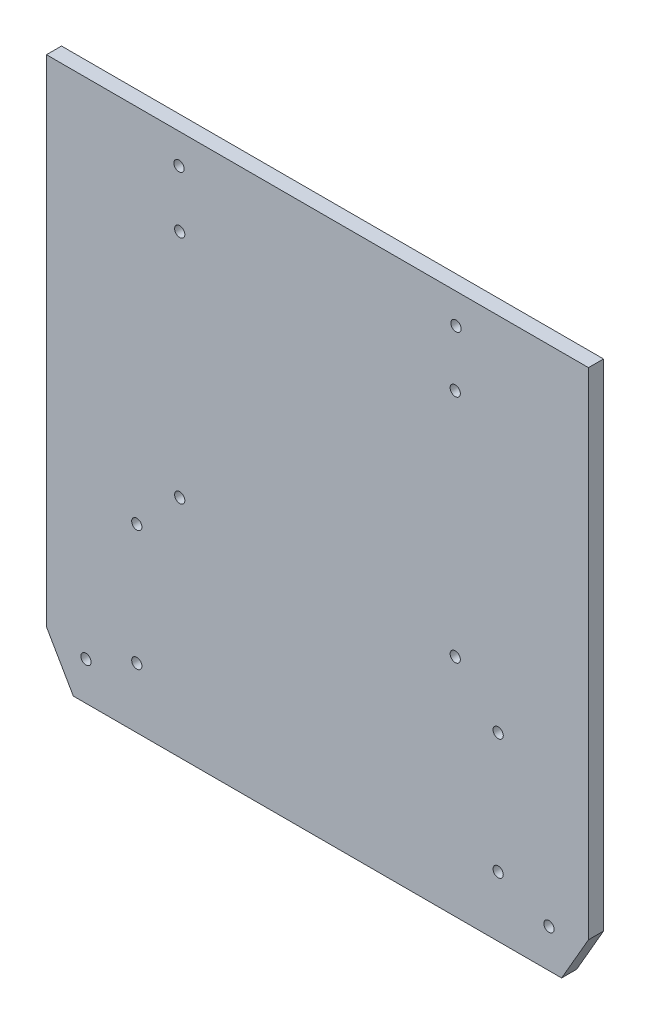
ISO-10303-21;
HEADER;
FILE_DESCRIPTION(('STEP AP214'),'2;1');
FILE_NAME('part.step','',(''),(''),'','','');
FILE_SCHEMA(('AUTOMOTIVE_DESIGN { 1 0 10303 214 1 1 1 1 }'));
ENDSEC;
DATA;
#1=APPLICATION_CONTEXT('core data for automotive mechanical design processes');
#2=APPLICATION_PROTOCOL_DEFINITION('international standard','automotive_design',2000,#1);
#3=PRODUCT_CONTEXT('',#1,'mechanical');
#4=PRODUCT('Part','Part','',(#3));
#5=PRODUCT_RELATED_PRODUCT_CATEGORY('part','',(#4));
#6=PRODUCT_DEFINITION_FORMATION('','',#4);
#7=PRODUCT_DEFINITION_CONTEXT('part definition',#1,'design');
#8=PRODUCT_DEFINITION('design','',#6,#7);
#9=PRODUCT_DEFINITION_SHAPE('','',#8);
#10=(LENGTH_UNIT() NAMED_UNIT(*) SI_UNIT(.MILLI.,.METRE.));
#11=(NAMED_UNIT(*) PLANE_ANGLE_UNIT() SI_UNIT($,.RADIAN.));
#12=(NAMED_UNIT(*) SI_UNIT($,.STERADIAN.) SOLID_ANGLE_UNIT());
#13=UNCERTAINTY_MEASURE_WITH_UNIT(LENGTH_MEASURE(1.E-05),#10,'distance_accuracy_value','');
#14=(GEOMETRIC_REPRESENTATION_CONTEXT(3) GLOBAL_UNCERTAINTY_ASSIGNED_CONTEXT((#13)) GLOBAL_UNIT_ASSIGNED_CONTEXT((#10,
#11,#12)) REPRESENTATION_CONTEXT('',''));
#15=CARTESIAN_POINT('',(0.,0.,0.));
#16=DIRECTION('',(0.,0.,1.));
#17=DIRECTION('',(1.,0.,0.));
#18=AXIS2_PLACEMENT_3D('',#15,#16,#17);
#19=CARTESIAN_POINT('',(-90.,90.,5.));
#20=DIRECTION('',(1.,0.,0.));
#21=DIRECTION('',(0.,1.,0.));
#22=AXIS2_PLACEMENT_3D('',#19,#20,#21);
#23=PLANE('',#22);
#24=DIRECTION('',(0.,-1.,0.));
#25=VECTOR('',#24,1.);
#26=CARTESIAN_POINT('',(-90.,90.,0.));
#27=LINE('',#26,#25);
#28=CARTESIAN_POINT('',(-90.,90.,0.));
#29=VERTEX_POINT('',#28);
#30=CARTESIAN_POINT('',(-90.,-74.5448267190433,0.));
#31=VERTEX_POINT('',#30);
#32=EDGE_CURVE('E108',#29,#31,#27,.T.);
#33=ORIENTED_EDGE('',*,*,#32,.T.);
#34=DIRECTION('',(0.,0.,1.));
#35=VECTOR('',#34,1.);
#36=CARTESIAN_POINT('',(-90.,-74.5448267190434,0.));
#37=LINE('',#36,#35);
#38=CARTESIAN_POINT('',(-90.,-74.5448267190434,5.));
#39=VERTEX_POINT('',#38);
#40=EDGE_CURVE('E55',#31,#39,#37,.T.);
#41=ORIENTED_EDGE('',*,*,#40,.T.);
#42=DIRECTION('',(0.,-1.,0.));
#43=VECTOR('',#42,1.);
#44=CARTESIAN_POINT('',(-90.,90.,5.));
#45=LINE('',#44,#43);
#46=CARTESIAN_POINT('',(-90.,90.,5.));
#47=VERTEX_POINT('',#46);
#48=EDGE_CURVE('E106',#47,#39,#45,.T.);
#49=ORIENTED_EDGE('',*,*,#48,.F.);
#50=DIRECTION('',(0.,0.,-1.));
#51=VECTOR('',#50,1.);
#52=CARTESIAN_POINT('',(-90.,90.,5.));
#53=LINE('',#52,#51);
#54=EDGE_CURVE('E40',#47,#29,#53,.T.);
#55=ORIENTED_EDGE('',*,*,#54,.T.);
#56=EDGE_LOOP('',(#33,#41,#49,#55));
#57=FACE_BOUND('',#56,.T.);
#58=ADVANCED_FACE('F33',(#57),#23,.F.);
#59=CARTESIAN_POINT('',(-90.,-90.,5.));
#60=DIRECTION('',(0.,1.,0.));
#61=DIRECTION('',(0.,0.,1.));
#62=AXIS2_PLACEMENT_3D('',#59,#60,#61);
#63=PLANE('',#62);
#64=DIRECTION('',(1.,0.,0.));
#65=VECTOR('',#64,1.);
#66=CARTESIAN_POINT('',(-90.,-90.,0.));
#67=LINE('',#66,#65);
#68=CARTESIAN_POINT('',(-81.0769515458673,-90.,0.));
#69=VERTEX_POINT('',#68);
#70=CARTESIAN_POINT('',(81.0769515458674,-90.,0.));
#71=VERTEX_POINT('',#70);
#72=EDGE_CURVE('E104',#69,#71,#67,.T.);
#73=ORIENTED_EDGE('',*,*,#72,.T.);
#74=DIRECTION('',(0.,0.,1.));
#75=VECTOR('',#74,1.);
#76=CARTESIAN_POINT('',(81.0769515458674,-90.,0.));
#77=LINE('',#76,#75);
#78=CARTESIAN_POINT('',(81.0769515458674,-90.,5.));
#79=VERTEX_POINT('',#78);
#80=EDGE_CURVE('E47',#71,#79,#77,.T.);
#81=ORIENTED_EDGE('',*,*,#80,.T.);
#82=DIRECTION('',(1.,0.,0.));
#83=VECTOR('',#82,1.);
#84=CARTESIAN_POINT('',(-90.,-90.,5.));
#85=LINE('',#84,#83);
#86=CARTESIAN_POINT('',(-81.0769515458673,-90.,5.));
#87=VERTEX_POINT('',#86);
#88=EDGE_CURVE('E121',#87,#79,#85,.T.);
#89=ORIENTED_EDGE('',*,*,#88,.F.);
#90=DIRECTION('',(0.,0.,1.));
#91=VECTOR('',#90,1.);
#92=CARTESIAN_POINT('',(-81.0769515458673,-90.,0.));
#93=LINE('',#92,#91);
#94=EDGE_CURVE('E146',#69,#87,#93,.T.);
#95=ORIENTED_EDGE('',*,*,#94,.F.);
#96=EDGE_LOOP('',(#73,#81,#89,#95));
#97=FACE_BOUND('',#96,.T.);
#98=ADVANCED_FACE('F145',(#97),#63,.F.);
#99=CARTESIAN_POINT('',(90.,90.,5.));
#100=DIRECTION('',(-1.,0.,0.));
#101=DIRECTION('',(0.,-1.,0.));
#102=AXIS2_PLACEMENT_3D('',#99,#100,#101);
#103=PLANE('',#102);
#104=DIRECTION('',(0.,1.,0.));
#105=VECTOR('',#104,1.);
#106=CARTESIAN_POINT('',(90.,90.,5.));
#107=LINE('',#106,#105);
#108=CARTESIAN_POINT('',(90.,-74.5448267190434,5.));
#109=VERTEX_POINT('',#108);
#110=CARTESIAN_POINT('',(90.,90.,5.));
#111=VERTEX_POINT('',#110);
#112=EDGE_CURVE('E98',#109,#111,#107,.T.);
#113=ORIENTED_EDGE('',*,*,#112,.F.);
#114=DIRECTION('',(0.,0.,1.));
#115=VECTOR('',#114,1.);
#116=CARTESIAN_POINT('',(90.,-74.5448267190434,0.));
#117=LINE('',#116,#115);
#118=CARTESIAN_POINT('',(90.,-74.5448267190434,0.));
#119=VERTEX_POINT('',#118);
#120=EDGE_CURVE('E85',#119,#109,#117,.T.);
#121=ORIENTED_EDGE('',*,*,#120,.F.);
#122=DIRECTION('',(0.,1.,0.));
#123=VECTOR('',#122,1.);
#124=CARTESIAN_POINT('',(90.,90.,0.));
#125=LINE('',#124,#123);
#126=CARTESIAN_POINT('',(90.,90.,0.));
#127=VERTEX_POINT('',#126);
#128=EDGE_CURVE('E97',#119,#127,#125,.T.);
#129=ORIENTED_EDGE('',*,*,#128,.T.);
#130=DIRECTION('',(0.,0.,-1.));
#131=VECTOR('',#130,1.);
#132=CARTESIAN_POINT('',(90.,90.,5.));
#133=LINE('',#132,#131);
#134=EDGE_CURVE('E11',#111,#127,#133,.T.);
#135=ORIENTED_EDGE('',*,*,#134,.F.);
#136=EDGE_LOOP('',(#113,#121,#129,#135));
#137=FACE_BOUND('',#136,.T.);
#138=ADVANCED_FACE('F95',(#137),#103,.F.);
#139=CARTESIAN_POINT('',(-90.,90.,5.));
#140=DIRECTION('',(0.,-1.,0.));
#141=DIRECTION('',(0.,0.,-1.));
#142=AXIS2_PLACEMENT_3D('',#139,#140,#141);
#143=PLANE('',#142);
#144=DIRECTION('',(-1.,0.,0.));
#145=VECTOR('',#144,1.);
#146=CARTESIAN_POINT('',(-90.,90.,0.));
#147=LINE('',#146,#145);
#148=EDGE_CURVE('E103',#127,#29,#147,.T.);
#149=ORIENTED_EDGE('',*,*,#148,.T.);
#150=ORIENTED_EDGE('',*,*,#54,.F.);
#151=DIRECTION('',(-1.,0.,0.));
#152=VECTOR('',#151,1.);
#153=CARTESIAN_POINT('',(-90.,90.,5.));
#154=LINE('',#153,#152);
#155=EDGE_CURVE('E112',#111,#47,#154,.T.);
#156=ORIENTED_EDGE('',*,*,#155,.F.);
#157=ORIENTED_EDGE('',*,*,#134,.T.);
#158=EDGE_LOOP('',(#149,#150,#156,#157));
#159=FACE_BOUND('',#158,.T.);
#160=ADVANCED_FACE('F163',(#159),#143,.F.);
#161=CARTESIAN_POINT('',(0.,0.,5.));
#162=DIRECTION('',(0.,0.,1.));
#163=DIRECTION('',(1.,0.,0.));
#164=AXIS2_PLACEMENT_3D('',#161,#162,#163);
#165=PLANE('',#164);
#166=CARTESIAN_POINT('',(-60.,-70.,5.));
#167=DIRECTION('',(0.,0.,1.));
#168=DIRECTION('',(1.,0.,0.));
#169=AXIS2_PLACEMENT_3D('',#166,#167,#168);
#170=CIRCLE('',#169,1.7);
#171=CARTESIAN_POINT('',(-58.3,-70.,5.));
#172=VERTEX_POINT('',#171);
#173=EDGE_CURVE('E412',#172,#172,#170,.T.);
#174=ORIENTED_EDGE('',*,*,#173,.F.);
#175=EDGE_LOOP('',(#174));
#176=FACE_BOUND('',#175,.T.);
#177=CARTESIAN_POINT('',(60.,-70.,5.));
#178=DIRECTION('',(0.,0.,1.));
#179=DIRECTION('',(-1.,0.,0.));
#180=AXIS2_PLACEMENT_3D('',#177,#178,#179);
#181=CIRCLE('',#180,1.7);
#182=CARTESIAN_POINT('',(58.3,-70.,5.));
#183=VERTEX_POINT('',#182);
#184=EDGE_CURVE('E406',#183,#183,#181,.T.);
#185=ORIENTED_EDGE('',*,*,#184,.F.);
#186=EDGE_LOOP('',(#185));
#187=FACE_BOUND('',#186,.T.);
#188=CARTESIAN_POINT('',(60.,-30.,5.));
#189=DIRECTION('',(0.,0.,1.));
#190=DIRECTION('',(-1.,0.,0.));
#191=AXIS2_PLACEMENT_3D('',#188,#189,#190);
#192=CIRCLE('',#191,1.7);
#193=CARTESIAN_POINT('',(58.3,-30.,5.));
#194=VERTEX_POINT('',#193);
#195=EDGE_CURVE('E400',#194,#194,#192,.T.);
#196=ORIENTED_EDGE('',*,*,#195,.F.);
#197=EDGE_LOOP('',(#196));
#198=FACE_BOUND('',#197,.T.);
#199=CARTESIAN_POINT('',(-60.,-30.,5.));
#200=DIRECTION('',(0.,0.,1.));
#201=DIRECTION('',(1.,0.,0.));
#202=AXIS2_PLACEMENT_3D('',#199,#200,#201);
#203=CIRCLE('',#202,1.7);
#204=CARTESIAN_POINT('',(-58.3,-30.,5.));
#205=VERTEX_POINT('',#204);
#206=EDGE_CURVE('E394',#205,#205,#203,.T.);
#207=ORIENTED_EDGE('',*,*,#206,.F.);
#208=EDGE_LOOP('',(#207));
#209=FACE_BOUND('',#208,.T.);
#210=CARTESIAN_POINT('',(45.75,61.25,5.));
#211=DIRECTION('',(0.,0.,1.));
#212=DIRECTION('',(-1.,0.,0.));
#213=AXIS2_PLACEMENT_3D('',#210,#211,#212);
#214=CIRCLE('',#213,1.7);
#215=CARTESIAN_POINT('',(44.05,61.25,5.));
#216=VERTEX_POINT('',#215);
#217=EDGE_CURVE('E389',#216,#216,#214,.T.);
#218=ORIENTED_EDGE('',*,*,#217,.F.);
#219=EDGE_LOOP('',(#218));
#220=FACE_BOUND('',#219,.T.);
#221=CARTESIAN_POINT('',(45.75,-15.25,5.));
#222=DIRECTION('',(0.,0.,1.));
#223=DIRECTION('',(1.,0.,0.));
#224=AXIS2_PLACEMENT_3D('',#221,#222,#223);
#225=CIRCLE('',#224,1.69999999999999);
#226=CARTESIAN_POINT('',(47.45,-15.25,5.));
#227=VERTEX_POINT('',#226);
#228=EDGE_CURVE('E383',#227,#227,#225,.T.);
#229=ORIENTED_EDGE('',*,*,#228,.F.);
#230=EDGE_LOOP('',(#229));
#231=FACE_BOUND('',#230,.T.);
#232=CARTESIAN_POINT('',(-45.75,-15.25,5.));
#233=DIRECTION('',(0.,0.,1.));
#234=DIRECTION('',(-1.,0.,0.));
#235=AXIS2_PLACEMENT_3D('',#232,#233,#234);
#236=CIRCLE('',#235,1.69999999999999);
#237=CARTESIAN_POINT('',(-47.45,-15.25,5.));
#238=VERTEX_POINT('',#237);
#239=EDGE_CURVE('E376',#238,#238,#236,.T.);
#240=ORIENTED_EDGE('',*,*,#239,.F.);
#241=EDGE_LOOP('',(#240));
#242=FACE_BOUND('',#241,.T.);
#243=CARTESIAN_POINT('',(-45.75,61.25,5.));
#244=DIRECTION('',(0.,0.,1.));
#245=DIRECTION('',(1.,0.,0.));
#246=AXIS2_PLACEMENT_3D('',#243,#244,#245);
#247=CIRCLE('',#246,1.7);
#248=CARTESIAN_POINT('',(-44.05,61.25,5.));
#249=VERTEX_POINT('',#248);
#250=EDGE_CURVE('E370',#249,#249,#247,.T.);
#251=ORIENTED_EDGE('',*,*,#250,.F.);
#252=EDGE_LOOP('',(#251));
#253=FACE_BOUND('',#252,.T.);
#254=CARTESIAN_POINT('',(76.8782217350893,-77.2724133595216,5.));
#255=DIRECTION('',(0.,0.,1.));
#256=DIRECTION('',(-1.,0.,0.));
#257=AXIS2_PLACEMENT_3D('',#254,#255,#256);
#258=CIRCLE('',#257,1.7);
#259=CARTESIAN_POINT('',(75.1782217350893,-77.2724133595216,5.));
#260=VERTEX_POINT('',#259);
#261=EDGE_CURVE('E364',#260,#260,#258,.T.);
#262=ORIENTED_EDGE('',*,*,#261,.F.);
#263=EDGE_LOOP('',(#262));
#264=FACE_BOUND('',#263,.T.);
#265=CARTESIAN_POINT('',(-76.8782217350893,-77.2724133595217,5.));
#266=DIRECTION('',(0.,0.,1.));
#267=DIRECTION('',(1.,0.,0.));
#268=AXIS2_PLACEMENT_3D('',#265,#266,#267);
#269=CIRCLE('',#268,1.7);
#270=CARTESIAN_POINT('',(-75.1782217350893,-77.2724133595217,5.));
#271=VERTEX_POINT('',#270);
#272=EDGE_CURVE('E358',#271,#271,#269,.T.);
#273=ORIENTED_EDGE('',*,*,#272,.F.);
#274=EDGE_LOOP('',(#273));
#275=FACE_BOUND('',#274,.T.);
#276=DIRECTION('',(-0.5,-0.866025403784439,0.));
#277=VECTOR('',#276,1.);
#278=CARTESIAN_POINT('',(81.0769515458674,-90.,5.));
#279=LINE('',#278,#277);
#280=EDGE_CURVE('E91',#109,#79,#279,.T.);
#281=ORIENTED_EDGE('',*,*,#280,.F.);
#282=ORIENTED_EDGE('',*,*,#112,.T.);
#283=ORIENTED_EDGE('',*,*,#155,.T.);
#284=ORIENTED_EDGE('',*,*,#48,.T.);
#285=DIRECTION('',(-0.500000000000001,0.866025403784438,0.));
#286=VECTOR('',#285,1.);
#287=CARTESIAN_POINT('',(-81.0769515458673,-90.,5.));
#288=LINE('',#287,#286);
#289=EDGE_CURVE('E142',#87,#39,#288,.T.);
#290=ORIENTED_EDGE('',*,*,#289,.F.);
#291=ORIENTED_EDGE('',*,*,#88,.T.);
#292=EDGE_LOOP('',(#281,#282,#283,#284,#290,#291));
#293=FACE_BOUND('',#292,.T.);
#294=CARTESIAN_POINT('',(46.,80.,5.));
#295=DIRECTION('',(0.,0.,1.));
#296=DIRECTION('',(-1.,0.,0.));
#297=AXIS2_PLACEMENT_3D('',#294,#295,#296);
#298=CIRCLE('',#297,1.7);
#299=CARTESIAN_POINT('',(44.3,80.,5.));
#300=VERTEX_POINT('',#299);
#301=EDGE_CURVE('E134',#300,#300,#298,.T.);
#302=ORIENTED_EDGE('',*,*,#301,.F.);
#303=EDGE_LOOP('',(#302));
#304=FACE_BOUND('',#303,.T.);
#305=CARTESIAN_POINT('',(-46.,80.,5.));
#306=DIRECTION('',(0.,0.,1.));
#307=DIRECTION('',(1.,0.,0.));
#308=AXIS2_PLACEMENT_3D('',#305,#306,#307);
#309=CIRCLE('',#308,1.7);
#310=CARTESIAN_POINT('',(-44.3,80.,5.));
#311=VERTEX_POINT('',#310);
#312=EDGE_CURVE('E126',#311,#311,#309,.T.);
#313=ORIENTED_EDGE('',*,*,#312,.F.);
#314=EDGE_LOOP('',(#313));
#315=FACE_BOUND('',#314,.T.);
#316=ADVANCED_FACE('F140',(#176,#187,#198,#209,#220,#231,#242,#253,#264,#275,#293,#304,#315),
#165,.T.);
#317=CARTESIAN_POINT('',(0.,0.,0.));
#318=DIRECTION('',(0.,0.,1.));
#319=DIRECTION('',(1.,0.,0.));
#320=AXIS2_PLACEMENT_3D('',#317,#318,#319);
#321=PLANE('',#320);
#322=CARTESIAN_POINT('',(-60.,-70.,0.));
#323=DIRECTION('',(0.,0.,1.));
#324=DIRECTION('',(1.,0.,0.));
#325=AXIS2_PLACEMENT_3D('',#322,#323,#324);
#326=CIRCLE('',#325,1.7);
#327=CARTESIAN_POINT('',(-58.3,-70.,0.));
#328=VERTEX_POINT('',#327);
#329=EDGE_CURVE('E397',#328,#328,#326,.T.);
#330=ORIENTED_EDGE('',*,*,#329,.T.);
#331=EDGE_LOOP('',(#330));
#332=FACE_BOUND('',#331,.T.);
#333=CARTESIAN_POINT('',(60.,-70.,0.));
#334=DIRECTION('',(0.,0.,1.));
#335=DIRECTION('',(-1.,0.,0.));
#336=AXIS2_PLACEMENT_3D('',#333,#334,#335);
#337=CIRCLE('',#336,1.7);
#338=CARTESIAN_POINT('',(58.3,-70.,0.));
#339=VERTEX_POINT('',#338);
#340=EDGE_CURVE('E409',#339,#339,#337,.T.);
#341=ORIENTED_EDGE('',*,*,#340,.T.);
#342=EDGE_LOOP('',(#341));
#343=FACE_BOUND('',#342,.T.);
#344=CARTESIAN_POINT('',(60.,-30.,0.));
#345=DIRECTION('',(0.,0.,1.));
#346=DIRECTION('',(-1.,0.,0.));
#347=AXIS2_PLACEMENT_3D('',#344,#345,#346);
#348=CIRCLE('',#347,1.7);
#349=CARTESIAN_POINT('',(58.3,-30.,0.));
#350=VERTEX_POINT('',#349);
#351=EDGE_CURVE('E403',#350,#350,#348,.T.);
#352=ORIENTED_EDGE('',*,*,#351,.T.);
#353=EDGE_LOOP('',(#352));
#354=FACE_BOUND('',#353,.T.);
#355=CARTESIAN_POINT('',(-60.,-30.,0.));
#356=DIRECTION('',(0.,0.,1.));
#357=DIRECTION('',(1.,0.,0.));
#358=AXIS2_PLACEMENT_3D('',#355,#356,#357);
#359=CIRCLE('',#358,1.7);
#360=CARTESIAN_POINT('',(-58.3,-30.,0.));
#361=VERTEX_POINT('',#360);
#362=EDGE_CURVE('E380',#361,#361,#359,.T.);
#363=ORIENTED_EDGE('',*,*,#362,.T.);
#364=EDGE_LOOP('',(#363));
#365=FACE_BOUND('',#364,.T.);
#366=CARTESIAN_POINT('',(45.75,61.25,0.));
#367=DIRECTION('',(0.,0.,1.));
#368=DIRECTION('',(-1.,0.,0.));
#369=AXIS2_PLACEMENT_3D('',#366,#367,#368);
#370=CIRCLE('',#369,1.7);
#371=CARTESIAN_POINT('',(44.05,61.25,0.));
#372=VERTEX_POINT('',#371);
#373=EDGE_CURVE('E373',#372,#372,#370,.T.);
#374=ORIENTED_EDGE('',*,*,#373,.T.);
#375=EDGE_LOOP('',(#374));
#376=FACE_BOUND('',#375,.T.);
#377=CARTESIAN_POINT('',(45.75,-15.25,0.));
#378=DIRECTION('',(0.,0.,1.));
#379=DIRECTION('',(1.,0.,0.));
#380=AXIS2_PLACEMENT_3D('',#377,#378,#379);
#381=CIRCLE('',#380,1.69999999999999);
#382=CARTESIAN_POINT('',(47.45,-15.25,0.));
#383=VERTEX_POINT('',#382);
#384=EDGE_CURVE('E386',#383,#383,#381,.T.);
#385=ORIENTED_EDGE('',*,*,#384,.T.);
#386=EDGE_LOOP('',(#385));
#387=FACE_BOUND('',#386,.T.);
#388=CARTESIAN_POINT('',(-45.75,-15.25,0.));
#389=DIRECTION('',(0.,0.,1.));
#390=DIRECTION('',(-1.,0.,0.));
#391=AXIS2_PLACEMENT_3D('',#388,#389,#390);
#392=CIRCLE('',#391,1.69999999999999);
#393=CARTESIAN_POINT('',(-47.45,-15.25,0.));
#394=VERTEX_POINT('',#393);
#395=EDGE_CURVE('E379',#394,#394,#392,.T.);
#396=ORIENTED_EDGE('',*,*,#395,.T.);
#397=EDGE_LOOP('',(#396));
#398=FACE_BOUND('',#397,.T.);
#399=CARTESIAN_POINT('',(-45.75,61.25,0.));
#400=DIRECTION('',(0.,0.,1.));
#401=DIRECTION('',(1.,0.,0.));
#402=AXIS2_PLACEMENT_3D('',#399,#400,#401);
#403=CIRCLE('',#402,1.7);
#404=CARTESIAN_POINT('',(-44.05,61.25,0.));
#405=VERTEX_POINT('',#404);
#406=EDGE_CURVE('E368',#405,#405,#403,.T.);
#407=ORIENTED_EDGE('',*,*,#406,.T.);
#408=EDGE_LOOP('',(#407));
#409=FACE_BOUND('',#408,.T.);
#410=CARTESIAN_POINT('',(76.8782217350893,-77.2724133595216,0.));
#411=DIRECTION('',(0.,0.,1.));
#412=DIRECTION('',(-1.,0.,0.));
#413=AXIS2_PLACEMENT_3D('',#410,#411,#412);
#414=CIRCLE('',#413,1.7);
#415=CARTESIAN_POINT('',(75.1782217350893,-77.2724133595216,0.));
#416=VERTEX_POINT('',#415);
#417=EDGE_CURVE('E360',#416,#416,#414,.T.);
#418=ORIENTED_EDGE('',*,*,#417,.T.);
#419=EDGE_LOOP('',(#418));
#420=FACE_BOUND('',#419,.T.);
#421=CARTESIAN_POINT('',(-76.8782217350893,-77.2724133595217,0.));
#422=DIRECTION('',(0.,0.,1.));
#423=DIRECTION('',(1.,0.,0.));
#424=AXIS2_PLACEMENT_3D('',#421,#422,#423);
#425=CIRCLE('',#424,1.7);
#426=CARTESIAN_POINT('',(-75.1782217350893,-77.2724133595217,0.));
#427=VERTEX_POINT('',#426);
#428=EDGE_CURVE('E355',#427,#427,#425,.T.);
#429=ORIENTED_EDGE('',*,*,#428,.T.);
#430=EDGE_LOOP('',(#429));
#431=FACE_BOUND('',#430,.T.);
#432=CARTESIAN_POINT('',(46.,80.,0.));
#433=DIRECTION('',(0.,0.,1.));
#434=DIRECTION('',(-1.,0.,0.));
#435=AXIS2_PLACEMENT_3D('',#432,#433,#434);
#436=CIRCLE('',#435,1.7);
#437=CARTESIAN_POINT('',(44.3,80.,0.));
#438=VERTEX_POINT('',#437);
#439=EDGE_CURVE('E131',#438,#438,#436,.T.);
#440=ORIENTED_EDGE('',*,*,#439,.T.);
#441=EDGE_LOOP('',(#440));
#442=FACE_BOUND('',#441,.T.);
#443=CARTESIAN_POINT('',(-46.,80.,0.));
#444=DIRECTION('',(0.,0.,1.));
#445=DIRECTION('',(1.,0.,0.));
#446=AXIS2_PLACEMENT_3D('',#443,#444,#445);
#447=CIRCLE('',#446,1.7);
#448=CARTESIAN_POINT('',(-44.3,80.,0.));
#449=VERTEX_POINT('',#448);
#450=EDGE_CURVE('E124',#449,#449,#447,.T.);
#451=ORIENTED_EDGE('',*,*,#450,.T.);
#452=EDGE_LOOP('',(#451));
#453=FACE_BOUND('',#452,.T.);
#454=ORIENTED_EDGE('',*,*,#128,.F.);
#455=DIRECTION('',(-0.5,-0.866025403784439,0.));
#456=VECTOR('',#455,1.);
#457=CARTESIAN_POINT('',(81.0769515458674,-90.,0.));
#458=LINE('',#457,#456);
#459=EDGE_CURVE('E82',#119,#71,#458,.T.);
#460=ORIENTED_EDGE('',*,*,#459,.T.);
#461=ORIENTED_EDGE('',*,*,#72,.F.);
#462=DIRECTION('',(-0.500000000000001,0.866025403784438,0.));
#463=VECTOR('',#462,1.);
#464=CARTESIAN_POINT('',(-81.0769515458673,-90.,0.));
#465=LINE('',#464,#463);
#466=EDGE_CURVE('E148',#69,#31,#465,.T.);
#467=ORIENTED_EDGE('',*,*,#466,.T.);
#468=ORIENTED_EDGE('',*,*,#32,.F.);
#469=ORIENTED_EDGE('',*,*,#148,.F.);
#470=EDGE_LOOP('',(#454,#460,#461,#467,#468,#469));
#471=FACE_BOUND('',#470,.T.);
#472=ADVANCED_FACE('F101',(#332,#343,#354,#365,#376,#387,#398,#409,#420,#431,#442,#453,#471),
#321,.F.);
#473=CARTESIAN_POINT('',(-46.,80.,0.));
#474=DIRECTION('',(0.,0.,1.));
#475=DIRECTION('',(1.,0.,0.));
#476=AXIS2_PLACEMENT_3D('',#473,#474,#475);
#477=CYLINDRICAL_SURFACE('',#476,1.7);
#478=ORIENTED_EDGE('',*,*,#450,.F.);
#479=EDGE_LOOP('',(#478));
#480=FACE_BOUND('',#479,.T.);
#481=ORIENTED_EDGE('',*,*,#312,.T.);
#482=EDGE_LOOP('',(#481));
#483=FACE_BOUND('',#482,.T.);
#484=ADVANCED_FACE('F168',(#480,#483),#477,.F.);
#485=CARTESIAN_POINT('',(46.,80.,0.));
#486=DIRECTION('',(0.,0.,1.));
#487=DIRECTION('',(1.,0.,0.));
#488=AXIS2_PLACEMENT_3D('',#485,#486,#487);
#489=CYLINDRICAL_SURFACE('',#488,1.7);
#490=ORIENTED_EDGE('',*,*,#439,.F.);
#491=EDGE_LOOP('',(#490));
#492=FACE_BOUND('',#491,.T.);
#493=ORIENTED_EDGE('',*,*,#301,.T.);
#494=EDGE_LOOP('',(#493));
#495=FACE_BOUND('',#494,.T.);
#496=ADVANCED_FACE('F160',(#492,#495),#489,.F.);
#497=CARTESIAN_POINT('',(-81.0769515458673,-90.,0.));
#498=DIRECTION('',(0.866025403784438,0.500000000000001,0.));
#499=DIRECTION('',(-0.500000000000001,0.866025403784438,0.));
#500=AXIS2_PLACEMENT_3D('',#497,#498,#499);
#501=PLANE('',#500);
#502=ORIENTED_EDGE('',*,*,#289,.T.);
#503=ORIENTED_EDGE('',*,*,#40,.F.);
#504=ORIENTED_EDGE('',*,*,#466,.F.);
#505=ORIENTED_EDGE('',*,*,#94,.T.);
#506=EDGE_LOOP('',(#502,#503,#504,#505));
#507=FACE_BOUND('',#506,.T.);
#508=ADVANCED_FACE('F176',(#507),#501,.F.);
#509=CARTESIAN_POINT('',(81.0769515458674,-90.,0.));
#510=DIRECTION('',(-0.866025403784439,0.5,0.));
#511=DIRECTION('',(-0.5,-0.866025403784439,0.));
#512=AXIS2_PLACEMENT_3D('',#509,#510,#511);
#513=PLANE('',#512);
#514=ORIENTED_EDGE('',*,*,#280,.T.);
#515=ORIENTED_EDGE('',*,*,#80,.F.);
#516=ORIENTED_EDGE('',*,*,#459,.F.);
#517=ORIENTED_EDGE('',*,*,#120,.T.);
#518=EDGE_LOOP('',(#514,#515,#516,#517));
#519=FACE_BOUND('',#518,.T.);
#520=ADVANCED_FACE('F84',(#519),#513,.F.);
#521=CARTESIAN_POINT('',(-76.8782217350893,-77.2724133595217,0.));
#522=DIRECTION('',(0.,0.,1.));
#523=DIRECTION('',(1.,0.,0.));
#524=AXIS2_PLACEMENT_3D('',#521,#522,#523);
#525=CYLINDRICAL_SURFACE('',#524,1.7);
#526=ORIENTED_EDGE('',*,*,#428,.F.);
#527=EDGE_LOOP('',(#526));
#528=FACE_BOUND('',#527,.T.);
#529=ORIENTED_EDGE('',*,*,#272,.T.);
#530=EDGE_LOOP('',(#529));
#531=FACE_BOUND('',#530,.T.);
#532=ADVANCED_FACE('F273',(#528,#531),#525,.F.);
#533=CARTESIAN_POINT('',(76.8782217350893,-77.2724133595216,0.));
#534=DIRECTION('',(0.,0.,1.));
#535=DIRECTION('',(1.,0.,0.));
#536=AXIS2_PLACEMENT_3D('',#533,#534,#535);
#537=CYLINDRICAL_SURFACE('',#536,1.7);
#538=ORIENTED_EDGE('',*,*,#417,.F.);
#539=EDGE_LOOP('',(#538));
#540=FACE_BOUND('',#539,.T.);
#541=ORIENTED_EDGE('',*,*,#261,.T.);
#542=EDGE_LOOP('',(#541));
#543=FACE_BOUND('',#542,.T.);
#544=ADVANCED_FACE('F269',(#540,#543),#537,.F.);
#545=CARTESIAN_POINT('',(-45.75,61.25,0.));
#546=DIRECTION('',(0.,0.,1.));
#547=DIRECTION('',(1.,0.,0.));
#548=AXIS2_PLACEMENT_3D('',#545,#546,#547);
#549=CYLINDRICAL_SURFACE('',#548,1.7);
#550=ORIENTED_EDGE('',*,*,#406,.F.);
#551=EDGE_LOOP('',(#550));
#552=FACE_BOUND('',#551,.T.);
#553=ORIENTED_EDGE('',*,*,#250,.T.);
#554=EDGE_LOOP('',(#553));
#555=FACE_BOUND('',#554,.T.);
#556=ADVANCED_FACE('F265',(#552,#555),#549,.F.);
#557=CARTESIAN_POINT('',(-45.75,-15.25,0.));
#558=DIRECTION('',(0.,0.,1.));
#559=DIRECTION('',(1.,0.,0.));
#560=AXIS2_PLACEMENT_3D('',#557,#558,#559);
#561=CYLINDRICAL_SURFACE('',#560,1.69999999999999);
#562=ORIENTED_EDGE('',*,*,#395,.F.);
#563=EDGE_LOOP('',(#562));
#564=FACE_BOUND('',#563,.T.);
#565=ORIENTED_EDGE('',*,*,#239,.T.);
#566=EDGE_LOOP('',(#565));
#567=FACE_BOUND('',#566,.T.);
#568=ADVANCED_FACE('F261',(#564,#567),#561,.F.);
#569=CARTESIAN_POINT('',(45.75,-15.25,0.));
#570=DIRECTION('',(0.,0.,1.));
#571=DIRECTION('',(1.,0.,0.));
#572=AXIS2_PLACEMENT_3D('',#569,#570,#571);
#573=CYLINDRICAL_SURFACE('',#572,1.69999999999999);
#574=ORIENTED_EDGE('',*,*,#384,.F.);
#575=EDGE_LOOP('',(#574));
#576=FACE_BOUND('',#575,.T.);
#577=ORIENTED_EDGE('',*,*,#228,.T.);
#578=EDGE_LOOP('',(#577));
#579=FACE_BOUND('',#578,.T.);
#580=ADVANCED_FACE('F257',(#576,#579),#573,.F.);
#581=CARTESIAN_POINT('',(45.75,61.25,0.));
#582=DIRECTION('',(0.,0.,1.));
#583=DIRECTION('',(1.,0.,0.));
#584=AXIS2_PLACEMENT_3D('',#581,#582,#583);
#585=CYLINDRICAL_SURFACE('',#584,1.7);
#586=ORIENTED_EDGE('',*,*,#373,.F.);
#587=EDGE_LOOP('',(#586));
#588=FACE_BOUND('',#587,.T.);
#589=ORIENTED_EDGE('',*,*,#217,.T.);
#590=EDGE_LOOP('',(#589));
#591=FACE_BOUND('',#590,.T.);
#592=ADVANCED_FACE('F217',(#588,#591),#585,.F.);
#593=CARTESIAN_POINT('',(-60.,-30.,0.));
#594=DIRECTION('',(0.,0.,1.));
#595=DIRECTION('',(1.,0.,0.));
#596=AXIS2_PLACEMENT_3D('',#593,#594,#595);
#597=CYLINDRICAL_SURFACE('',#596,1.7);
#598=ORIENTED_EDGE('',*,*,#362,.F.);
#599=EDGE_LOOP('',(#598));
#600=FACE_BOUND('',#599,.T.);
#601=ORIENTED_EDGE('',*,*,#206,.T.);
#602=EDGE_LOOP('',(#601));
#603=FACE_BOUND('',#602,.T.);
#604=ADVANCED_FACE('F211',(#600,#603),#597,.F.);
#605=CARTESIAN_POINT('',(60.,-30.,0.));
#606=DIRECTION('',(0.,0.,1.));
#607=DIRECTION('',(1.,0.,0.));
#608=AXIS2_PLACEMENT_3D('',#605,#606,#607);
#609=CYLINDRICAL_SURFACE('',#608,1.7);
#610=ORIENTED_EDGE('',*,*,#351,.F.);
#611=EDGE_LOOP('',(#610));
#612=FACE_BOUND('',#611,.T.);
#613=ORIENTED_EDGE('',*,*,#195,.T.);
#614=EDGE_LOOP('',(#613));
#615=FACE_BOUND('',#614,.T.);
#616=ADVANCED_FACE('F216',(#612,#615),#609,.F.);
#617=CARTESIAN_POINT('',(60.,-70.,0.));
#618=DIRECTION('',(0.,0.,1.));
#619=DIRECTION('',(1.,0.,0.));
#620=AXIS2_PLACEMENT_3D('',#617,#618,#619);
#621=CYLINDRICAL_SURFACE('',#620,1.7);
#622=ORIENTED_EDGE('',*,*,#340,.F.);
#623=EDGE_LOOP('',(#622));
#624=FACE_BOUND('',#623,.T.);
#625=ORIENTED_EDGE('',*,*,#184,.T.);
#626=EDGE_LOOP('',(#625));
#627=FACE_BOUND('',#626,.T.);
#628=ADVANCED_FACE('F229',(#624,#627),#621,.F.);
#629=CARTESIAN_POINT('',(-60.,-70.,0.));
#630=DIRECTION('',(0.,0.,1.));
#631=DIRECTION('',(1.,0.,0.));
#632=AXIS2_PLACEMENT_3D('',#629,#630,#631);
#633=CYLINDRICAL_SURFACE('',#632,1.7);
#634=ORIENTED_EDGE('',*,*,#329,.F.);
#635=EDGE_LOOP('',(#634));
#636=FACE_BOUND('',#635,.T.);
#637=ORIENTED_EDGE('',*,*,#173,.T.);
#638=EDGE_LOOP('',(#637));
#639=FACE_BOUND('',#638,.T.);
#640=ADVANCED_FACE('F239',(#636,#639),#633,.F.);
#641=CLOSED_SHELL('',(#58,#98,#138,#160,#316,#472,#484,#496,#508,#520,#532,#544,#556,#568,#580,
#592,#604,#616,#628,#640));
#642=MANIFOLD_SOLID_BREP('B2',#641);
#643=ADVANCED_BREP_SHAPE_REPRESENTATION('',(#18,#642),#14);
#644=SHAPE_DEFINITION_REPRESENTATION(#9,#643);
ENDSEC;
END-ISO-10303-21;
